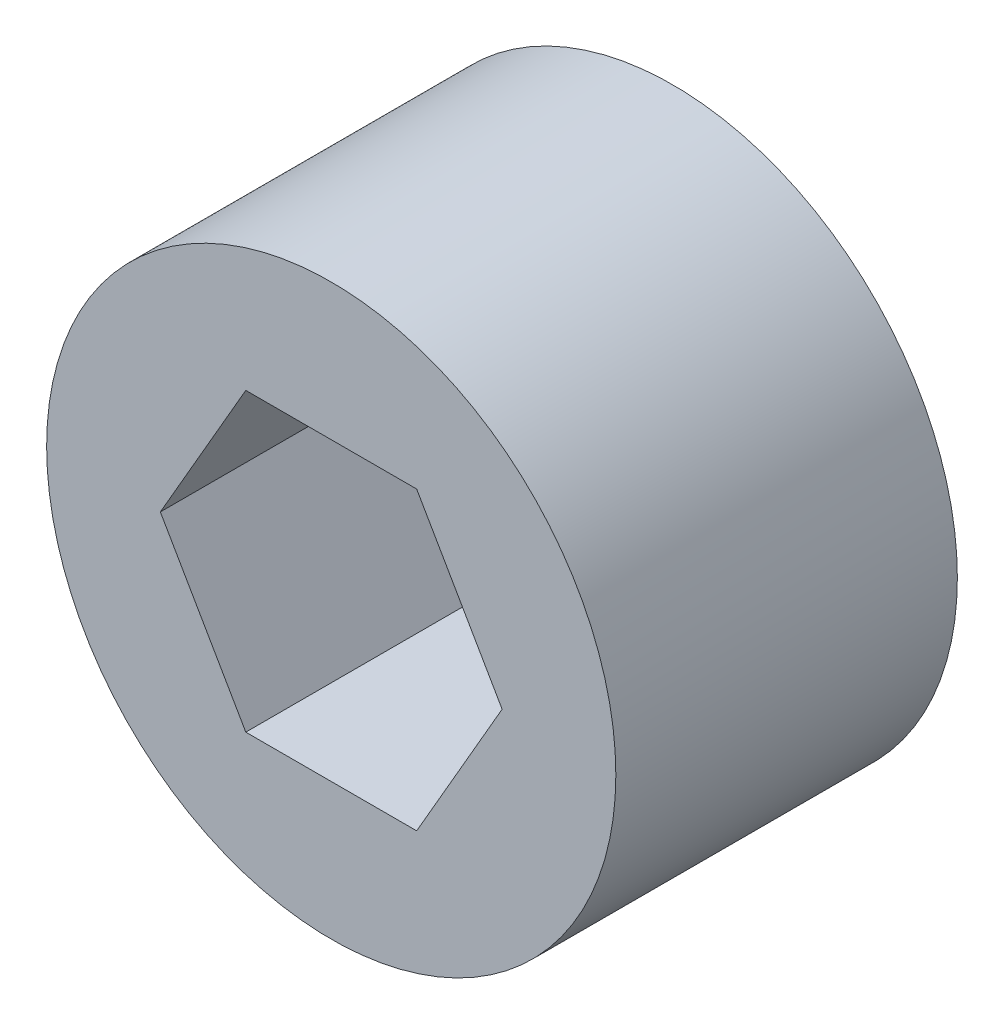
ISO-10303-21;
HEADER;
FILE_DESCRIPTION(('STEP AP214'),'2;1');
FILE_NAME('part.step','',(''),(''),'','','');
FILE_SCHEMA(('AUTOMOTIVE_DESIGN { 1 0 10303 214 1 1 1 1 }'));
ENDSEC;
DATA;
#1=APPLICATION_CONTEXT('core data for automotive mechanical design processes');
#2=APPLICATION_PROTOCOL_DEFINITION('international standard','automotive_design',2000,#1);
#3=PRODUCT_CONTEXT('',#1,'mechanical');
#4=PRODUCT('Part','Part','',(#3));
#5=PRODUCT_RELATED_PRODUCT_CATEGORY('part','',(#4));
#6=PRODUCT_DEFINITION_FORMATION('','',#4);
#7=PRODUCT_DEFINITION_CONTEXT('part definition',#1,'design');
#8=PRODUCT_DEFINITION('design','',#6,#7);
#9=PRODUCT_DEFINITION_SHAPE('','',#8);
#10=(LENGTH_UNIT() NAMED_UNIT(*) SI_UNIT(.MILLI.,.METRE.));
#11=(NAMED_UNIT(*) PLANE_ANGLE_UNIT() SI_UNIT($,.RADIAN.));
#12=(NAMED_UNIT(*) SI_UNIT($,.STERADIAN.) SOLID_ANGLE_UNIT());
#13=UNCERTAINTY_MEASURE_WITH_UNIT(LENGTH_MEASURE(1.E-05),#10,'distance_accuracy_value','');
#14=(GEOMETRIC_REPRESENTATION_CONTEXT(3) GLOBAL_UNCERTAINTY_ASSIGNED_CONTEXT((#13)) GLOBAL_UNIT_ASSIGNED_CONTEXT((#10,
#11,#12)) REPRESENTATION_CONTEXT('',''));
#15=CARTESIAN_POINT('',(0.,0.,0.));
#16=DIRECTION('',(0.,0.,1.));
#17=DIRECTION('',(1.,0.,0.));
#18=AXIS2_PLACEMENT_3D('',#15,#16,#17);
#19=CARTESIAN_POINT('',(0.,0.,15.24));
#20=DIRECTION('',(0.,0.,1.));
#21=DIRECTION('',(1.,0.,0.));
#22=AXIS2_PLACEMENT_3D('',#19,#20,#21);
#23=PLANE('',#22);
#24=CARTESIAN_POINT('',(0.,0.,15.24));
#25=DIRECTION('',(0.,0.,1.));
#26=DIRECTION('',(1.,0.,0.));
#27=AXIS2_PLACEMENT_3D('',#24,#25,#26);
#28=CIRCLE('',#27,12.7);
#29=CARTESIAN_POINT('',(-12.7,0.,15.24));
#30=VERTEX_POINT('',#29);
#31=EDGE_CURVE('E11',#30,#30,#28,.T.);
#32=ORIENTED_EDGE('',*,*,#31,.T.);
#33=EDGE_LOOP('',(#32));
#34=FACE_BOUND('',#33,.T.);
#35=DIRECTION('',(0.5,0.866025403784438,0.));
#36=VECTOR('',#35,1.);
#37=CARTESIAN_POINT('',(3.81282117772829,-6.604,15.24));
#38=LINE('',#37,#36);
#39=CARTESIAN_POINT('',(3.81282117772829,-6.604,15.24));
#40=VERTEX_POINT('',#39);
#41=CARTESIAN_POINT('',(7.62564235545658,0.,15.24));
#42=VERTEX_POINT('',#41);
#43=EDGE_CURVE('E98',#40,#42,#38,.T.);
#44=ORIENTED_EDGE('',*,*,#43,.F.);
#45=DIRECTION('',(1.,0.,0.));
#46=VECTOR('',#45,1.);
#47=CARTESIAN_POINT('',(-3.81282117772829,-6.604,15.24));
#48=LINE('',#47,#46);
#49=CARTESIAN_POINT('',(-3.81282117772829,-6.604,15.24));
#50=VERTEX_POINT('',#49);
#51=EDGE_CURVE('E90',#50,#40,#48,.T.);
#52=ORIENTED_EDGE('',*,*,#51,.F.);
#53=DIRECTION('',(0.5,-0.866025403784439,0.));
#54=VECTOR('',#53,1.);
#55=CARTESIAN_POINT('',(-7.62564235545658,0.,15.24));
#56=LINE('',#55,#54);
#57=CARTESIAN_POINT('',(-7.62564235545658,0.,15.24));
#58=VERTEX_POINT('',#57);
#59=EDGE_CURVE('E118',#58,#50,#56,.T.);
#60=ORIENTED_EDGE('',*,*,#59,.F.);
#61=DIRECTION('',(-0.5,-0.866025403784438,0.));
#62=VECTOR('',#61,1.);
#63=CARTESIAN_POINT('',(-3.81282117772829,6.604,15.24));
#64=LINE('',#63,#62);
#65=CARTESIAN_POINT('',(-3.81282117772829,6.604,15.24));
#66=VERTEX_POINT('',#65);
#67=EDGE_CURVE('E116',#66,#58,#64,.T.);
#68=ORIENTED_EDGE('',*,*,#67,.F.);
#69=DIRECTION('',(-1.,0.,0.));
#70=VECTOR('',#69,1.);
#71=CARTESIAN_POINT('',(3.81282117772829,6.604,15.24));
#72=LINE('',#71,#70);
#73=CARTESIAN_POINT('',(3.81282117772829,6.604,15.24));
#74=VERTEX_POINT('',#73);
#75=EDGE_CURVE('E112',#74,#66,#72,.T.);
#76=ORIENTED_EDGE('',*,*,#75,.F.);
#77=DIRECTION('',(-0.5,0.866025403784439,0.));
#78=VECTOR('',#77,1.);
#79=CARTESIAN_POINT('',(7.62564235545658,0.,15.24));
#80=LINE('',#79,#78);
#81=EDGE_CURVE('E110',#42,#74,#80,.T.);
#82=ORIENTED_EDGE('',*,*,#81,.F.);
#83=EDGE_LOOP('',(#44,#52,#60,#68,#76,#82));
#84=FACE_BOUND('',#83,.T.);
#85=ADVANCED_FACE('F37',(#34,#84),#23,.T.);
#86=CARTESIAN_POINT('',(0.,0.,0.));
#87=DIRECTION('',(0.,0.,1.));
#88=DIRECTION('',(1.,0.,0.));
#89=AXIS2_PLACEMENT_3D('',#86,#87,#88);
#90=PLANE('',#89);
#91=CARTESIAN_POINT('',(0.,0.,0.));
#92=DIRECTION('',(0.,0.,1.));
#93=DIRECTION('',(1.,0.,0.));
#94=AXIS2_PLACEMENT_3D('',#91,#92,#93);
#95=CIRCLE('',#94,12.7);
#96=CARTESIAN_POINT('',(-12.7,0.,0.));
#97=VERTEX_POINT('',#96);
#98=EDGE_CURVE('E41',#97,#97,#95,.T.);
#99=ORIENTED_EDGE('',*,*,#98,.F.);
#100=EDGE_LOOP('',(#99));
#101=FACE_BOUND('',#100,.T.);
#102=DIRECTION('',(1.,0.,0.));
#103=VECTOR('',#102,1.);
#104=CARTESIAN_POINT('',(-3.81282117772829,-6.604,0.));
#105=LINE('',#104,#103);
#106=CARTESIAN_POINT('',(-3.81282117772829,-6.604,0.));
#107=VERTEX_POINT('',#106);
#108=CARTESIAN_POINT('',(3.81282117772829,-6.604,0.));
#109=VERTEX_POINT('',#108);
#110=EDGE_CURVE('E60',#107,#109,#105,.T.);
#111=ORIENTED_EDGE('',*,*,#110,.T.);
#112=DIRECTION('',(0.5,0.866025403784438,0.));
#113=VECTOR('',#112,1.);
#114=CARTESIAN_POINT('',(3.81282117772829,-6.604,0.));
#115=LINE('',#114,#113);
#116=CARTESIAN_POINT('',(7.62564235545658,0.,0.));
#117=VERTEX_POINT('',#116);
#118=EDGE_CURVE('E105',#109,#117,#115,.T.);
#119=ORIENTED_EDGE('',*,*,#118,.T.);
#120=DIRECTION('',(-0.5,0.866025403784439,0.));
#121=VECTOR('',#120,1.);
#122=CARTESIAN_POINT('',(7.62564235545658,0.,0.));
#123=LINE('',#122,#121);
#124=CARTESIAN_POINT('',(3.81282117772829,6.604,0.));
#125=VERTEX_POINT('',#124);
#126=EDGE_CURVE('E122',#117,#125,#123,.T.);
#127=ORIENTED_EDGE('',*,*,#126,.T.);
#128=DIRECTION('',(-1.,0.,0.));
#129=VECTOR('',#128,1.);
#130=CARTESIAN_POINT('',(3.81282117772829,6.604,0.));
#131=LINE('',#130,#129);
#132=CARTESIAN_POINT('',(-3.81282117772829,6.604,0.));
#133=VERTEX_POINT('',#132);
#134=EDGE_CURVE('E125',#125,#133,#131,.T.);
#135=ORIENTED_EDGE('',*,*,#134,.T.);
#136=DIRECTION('',(-0.5,-0.866025403784438,0.));
#137=VECTOR('',#136,1.);
#138=CARTESIAN_POINT('',(-3.81282117772829,6.604,0.));
#139=LINE('',#138,#137);
#140=CARTESIAN_POINT('',(-7.62564235545658,0.,0.));
#141=VERTEX_POINT('',#140);
#142=EDGE_CURVE('E128',#133,#141,#139,.T.);
#143=ORIENTED_EDGE('',*,*,#142,.T.);
#144=DIRECTION('',(0.5,-0.866025403784439,0.));
#145=VECTOR('',#144,1.);
#146=CARTESIAN_POINT('',(-7.62564235545658,0.,0.));
#147=LINE('',#146,#145);
#148=EDGE_CURVE('E99',#141,#107,#147,.T.);
#149=ORIENTED_EDGE('',*,*,#148,.T.);
#150=EDGE_LOOP('',(#111,#119,#127,#135,#143,#149));
#151=FACE_BOUND('',#150,.T.);
#152=ADVANCED_FACE('F145',(#101,#151),#90,.F.);
#153=CARTESIAN_POINT('',(0.,0.,15.24));
#154=DIRECTION('',(0.,0.,-1.));
#155=DIRECTION('',(-1.,0.,0.));
#156=AXIS2_PLACEMENT_3D('',#153,#154,#155);
#157=CYLINDRICAL_SURFACE('',#156,12.7);
#158=CARTESIAN_POINT('',(-12.7,0.,15.24));
#159=CARTESIAN_POINT('',(-12.7,0.,15.08125));
#160=CARTESIAN_POINT('',(-12.7,0.,14.9225));
#161=CARTESIAN_POINT('',(-12.7,0.,14.605));
#162=CARTESIAN_POINT('',(-12.7,0.,14.44625));
#163=CARTESIAN_POINT('',(-12.7,0.,14.12875));
#164=CARTESIAN_POINT('',(-12.7,0.,13.97));
#165=CARTESIAN_POINT('',(-12.7,0.,13.6525));
#166=CARTESIAN_POINT('',(-12.7,0.,13.49375));
#167=CARTESIAN_POINT('',(-12.7,0.,13.17625));
#168=CARTESIAN_POINT('',(-12.7,0.,13.0175));
#169=CARTESIAN_POINT('',(-12.7,0.,12.7));
#170=CARTESIAN_POINT('',(-12.7,0.,12.54125));
#171=CARTESIAN_POINT('',(-12.7,0.,12.22375));
#172=CARTESIAN_POINT('',(-12.7,0.,12.065));
#173=CARTESIAN_POINT('',(-12.7,0.,11.7475));
#174=CARTESIAN_POINT('',(-12.7,0.,11.58875));
#175=CARTESIAN_POINT('',(-12.7,0.,11.27125));
#176=CARTESIAN_POINT('',(-12.7,0.,11.1125));
#177=CARTESIAN_POINT('',(-12.7,0.,10.795));
#178=CARTESIAN_POINT('',(-12.7,0.,10.63625));
#179=CARTESIAN_POINT('',(-12.7,0.,10.31875));
#180=CARTESIAN_POINT('',(-12.7,0.,10.16));
#181=CARTESIAN_POINT('',(-12.7,0.,9.8425));
#182=CARTESIAN_POINT('',(-12.7,0.,9.68375));
#183=CARTESIAN_POINT('',(-12.7,0.,9.36625));
#184=CARTESIAN_POINT('',(-12.7,0.,9.2075));
#185=CARTESIAN_POINT('',(-12.7,0.,8.89));
#186=CARTESIAN_POINT('',(-12.7,0.,8.73125));
#187=CARTESIAN_POINT('',(-12.7,0.,8.41375));
#188=CARTESIAN_POINT('',(-12.7,0.,8.255));
#189=CARTESIAN_POINT('',(-12.7,0.,7.9375));
#190=CARTESIAN_POINT('',(-12.7,0.,7.77875));
#191=CARTESIAN_POINT('',(-12.7,0.,7.46125));
#192=CARTESIAN_POINT('',(-12.7,0.,7.3025));
#193=CARTESIAN_POINT('',(-12.7,0.,6.985));
#194=CARTESIAN_POINT('',(-12.7,0.,6.82625));
#195=CARTESIAN_POINT('',(-12.7,0.,6.50875));
#196=CARTESIAN_POINT('',(-12.7,0.,6.35));
#197=CARTESIAN_POINT('',(-12.7,0.,6.0325));
#198=CARTESIAN_POINT('',(-12.7,0.,5.87375));
#199=CARTESIAN_POINT('',(-12.7,0.,5.55625));
#200=CARTESIAN_POINT('',(-12.7,0.,5.3975));
#201=CARTESIAN_POINT('',(-12.7,0.,5.08));
#202=CARTESIAN_POINT('',(-12.7,0.,4.92125));
#203=CARTESIAN_POINT('',(-12.7,0.,4.60375));
#204=CARTESIAN_POINT('',(-12.7,0.,4.445));
#205=CARTESIAN_POINT('',(-12.7,0.,4.1275));
#206=CARTESIAN_POINT('',(-12.7,0.,3.96875));
#207=CARTESIAN_POINT('',(-12.7,0.,3.65125));
#208=CARTESIAN_POINT('',(-12.7,0.,3.4925));
#209=CARTESIAN_POINT('',(-12.7,0.,3.175));
#210=CARTESIAN_POINT('',(-12.7,0.,3.01625));
#211=CARTESIAN_POINT('',(-12.7,0.,2.69875));
#212=CARTESIAN_POINT('',(-12.7,0.,2.54));
#213=CARTESIAN_POINT('',(-12.7,0.,2.2225));
#214=CARTESIAN_POINT('',(-12.7,0.,2.06375));
#215=CARTESIAN_POINT('',(-12.7,0.,1.74625));
#216=CARTESIAN_POINT('',(-12.7,0.,1.5875));
#217=CARTESIAN_POINT('',(-12.7,0.,1.27));
#218=CARTESIAN_POINT('',(-12.7,0.,1.11125));
#219=CARTESIAN_POINT('',(-12.7,0.,0.79375));
#220=CARTESIAN_POINT('',(-12.7,0.,0.634999999999999));
#221=CARTESIAN_POINT('',(-12.7,0.,0.3175));
#222=CARTESIAN_POINT('',(-12.7,0.,0.15875));
#223=CARTESIAN_POINT('',(-12.7,0.,0.));
#224=B_SPLINE_CURVE_WITH_KNOTS('',3,(#158,#159,#160,#161,#162,#163,#164,#165,#166,#167,#168,
#169,#170,#171,#172,#173,#174,#175,#176,#177,#178,#179,#180,#181,#182,#183,#184,#185,#186,#187,
#188,#189,#190,#191,#192,#193,#194,#195,#196,#197,#198,#199,#200,#201,#202,#203,#204,#205,#206,
#207,#208,#209,#210,#211,#212,#213,#214,#215,#216,#217,#218,#219,#220,#221,#222,#223),
.UNSPECIFIED.,.F.,.F.,(4,2,2,2,2,2,2,2,2,2,2,2,2,2,2,2,2,2,2,2,2,2,2,2,2,2,2,2,2,2,2,2,4),(0.,
0.476249999999999,0.952499999999998,1.42875,1.905,2.38125,2.8575,3.33375,3.81,4.28625,4.7625,
5.23875,5.715,6.19125,6.6675,7.14375,7.62,8.09625,8.5725,9.04875,9.525,10.00125,10.4775,
10.95375,11.43,11.90625,12.3825,12.85875,13.335,13.81125,14.2875,14.76375,15.24),.UNSPECIFIED.);
#225=EDGE_CURVE('BSEAM39',#30,#97,#224,.T.);
#226=ORIENTED_EDGE('',*,*,#31,.F.);
#227=ORIENTED_EDGE('',*,*,#98,.T.);
#228=ORIENTED_EDGE('',*,*,#225,.T.);
#229=ORIENTED_EDGE('',*,*,#225,.F.);
#230=EDGE_LOOP('',(#226,#228,#227,#229));
#231=FACE_BOUND('',#230,.T.);
#232=ADVANCED_FACE('F39',(#231),#157,.T.);
#233=CARTESIAN_POINT('',(-3.81282117772829,-6.604,15.24));
#234=DIRECTION('',(0.,1.,0.));
#235=DIRECTION('',(0.,0.,1.));
#236=AXIS2_PLACEMENT_3D('',#233,#234,#235);
#237=PLANE('',#236);
#238=ORIENTED_EDGE('',*,*,#110,.F.);
#239=DIRECTION('',(0.,0.,-1.));
#240=VECTOR('',#239,1.);
#241=CARTESIAN_POINT('',(-3.81282117772829,-6.604,15.24));
#242=LINE('',#241,#240);
#243=EDGE_CURVE('E94',#50,#107,#242,.T.);
#244=ORIENTED_EDGE('',*,*,#243,.F.);
#245=ORIENTED_EDGE('',*,*,#51,.T.);
#246=DIRECTION('',(0.,0.,-1.));
#247=VECTOR('',#246,1.);
#248=CARTESIAN_POINT('',(3.81282117772829,-6.604,15.24));
#249=LINE('',#248,#247);
#250=EDGE_CURVE('E93',#40,#109,#249,.T.);
#251=ORIENTED_EDGE('',*,*,#250,.T.);
#252=EDGE_LOOP('',(#238,#244,#245,#251));
#253=FACE_BOUND('',#252,.T.);
#254=ADVANCED_FACE('F92',(#253),#237,.T.);
#255=CARTESIAN_POINT('',(3.81282117772829,-6.604,15.24));
#256=DIRECTION('',(-0.866025403784439,0.5,0.));
#257=DIRECTION('',(-0.5,-0.866025403784439,0.));
#258=AXIS2_PLACEMENT_3D('',#255,#256,#257);
#259=PLANE('',#258);
#260=ORIENTED_EDGE('',*,*,#118,.F.);
#261=ORIENTED_EDGE('',*,*,#250,.F.);
#262=ORIENTED_EDGE('',*,*,#43,.T.);
#263=DIRECTION('',(0.,0.,-1.));
#264=VECTOR('',#263,1.);
#265=CARTESIAN_POINT('',(7.62564235545658,0.,15.24));
#266=LINE('',#265,#264);
#267=EDGE_CURVE('E106',#42,#117,#266,.T.);
#268=ORIENTED_EDGE('',*,*,#267,.T.);
#269=EDGE_LOOP('',(#260,#261,#262,#268));
#270=FACE_BOUND('',#269,.T.);
#271=ADVANCED_FACE('F102',(#270),#259,.T.);
#272=CARTESIAN_POINT('',(7.62564235545658,0.,15.24));
#273=DIRECTION('',(-0.866025403784439,-0.5,0.));
#274=DIRECTION('',(0.5,-0.866025403784439,0.));
#275=AXIS2_PLACEMENT_3D('',#272,#273,#274);
#276=PLANE('',#275);
#277=ORIENTED_EDGE('',*,*,#126,.F.);
#278=ORIENTED_EDGE('',*,*,#267,.F.);
#279=ORIENTED_EDGE('',*,*,#81,.T.);
#280=DIRECTION('',(0.,0.,-1.));
#281=VECTOR('',#280,1.);
#282=CARTESIAN_POINT('',(3.81282117772829,6.604,15.24));
#283=LINE('',#282,#281);
#284=EDGE_CURVE('E137',#74,#125,#283,.T.);
#285=ORIENTED_EDGE('',*,*,#284,.T.);
#286=EDGE_LOOP('',(#277,#278,#279,#285));
#287=FACE_BOUND('',#286,.T.);
#288=ADVANCED_FACE('F141',(#287),#276,.T.);
#289=CARTESIAN_POINT('',(3.81282117772829,6.604,15.24));
#290=DIRECTION('',(0.,-1.,0.));
#291=DIRECTION('',(1.,0.,0.));
#292=AXIS2_PLACEMENT_3D('',#289,#290,#291);
#293=PLANE('',#292);
#294=ORIENTED_EDGE('',*,*,#134,.F.);
#295=ORIENTED_EDGE('',*,*,#284,.F.);
#296=ORIENTED_EDGE('',*,*,#75,.T.);
#297=DIRECTION('',(0.,0.,-1.));
#298=VECTOR('',#297,1.);
#299=CARTESIAN_POINT('',(-3.81282117772829,6.604,15.24));
#300=LINE('',#299,#298);
#301=EDGE_CURVE('E135',#66,#133,#300,.T.);
#302=ORIENTED_EDGE('',*,*,#301,.T.);
#303=EDGE_LOOP('',(#294,#295,#296,#302));
#304=FACE_BOUND('',#303,.T.);
#305=ADVANCED_FACE('F153',(#304),#293,.T.);
#306=CARTESIAN_POINT('',(-3.81282117772829,6.604,15.24));
#307=DIRECTION('',(0.866025403784439,-0.5,0.));
#308=DIRECTION('',(0.5,0.866025403784439,0.));
#309=AXIS2_PLACEMENT_3D('',#306,#307,#308);
#310=PLANE('',#309);
#311=ORIENTED_EDGE('',*,*,#142,.F.);
#312=ORIENTED_EDGE('',*,*,#301,.F.);
#313=ORIENTED_EDGE('',*,*,#67,.T.);
#314=DIRECTION('',(0.,0.,-1.));
#315=VECTOR('',#314,1.);
#316=CARTESIAN_POINT('',(-7.62564235545658,0.,15.24));
#317=LINE('',#316,#315);
#318=EDGE_CURVE('E52',#58,#141,#317,.T.);
#319=ORIENTED_EDGE('',*,*,#318,.T.);
#320=EDGE_LOOP('',(#311,#312,#313,#319));
#321=FACE_BOUND('',#320,.T.);
#322=ADVANCED_FACE('F151',(#321),#310,.T.);
#323=CARTESIAN_POINT('',(-7.62564235545658,0.,15.24));
#324=DIRECTION('',(0.866025403784439,0.5,0.));
#325=DIRECTION('',(-0.5,0.866025403784439,0.));
#326=AXIS2_PLACEMENT_3D('',#323,#324,#325);
#327=PLANE('',#326);
#328=ORIENTED_EDGE('',*,*,#148,.F.);
#329=ORIENTED_EDGE('',*,*,#318,.F.);
#330=ORIENTED_EDGE('',*,*,#59,.T.);
#331=ORIENTED_EDGE('',*,*,#243,.T.);
#332=EDGE_LOOP('',(#328,#329,#330,#331));
#333=FACE_BOUND('',#332,.T.);
#334=ADVANCED_FACE('F147',(#333),#327,.T.);
#335=CLOSED_SHELL('',(#85,#152,#232,#254,#271,#288,#305,#322,#334));
#336=MANIFOLD_SOLID_BREP('B2',#335);
#337=ADVANCED_BREP_SHAPE_REPRESENTATION('',(#18,#336),#14);
#338=SHAPE_DEFINITION_REPRESENTATION(#9,#337);
ENDSEC;
END-ISO-10303-21;
